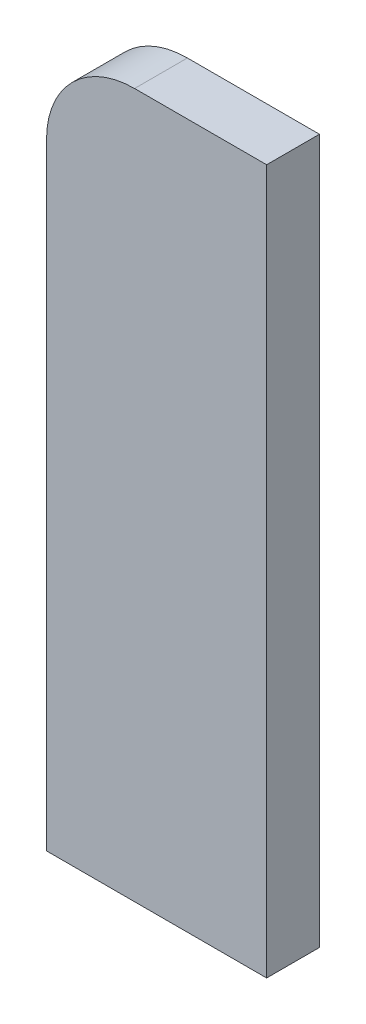
ISO-10303-21;
HEADER;
FILE_DESCRIPTION(('STEP AP214'),'2;1');
FILE_NAME('part.step','',(''),(''),'','','');
FILE_SCHEMA(('AUTOMOTIVE_DESIGN { 1 0 10303 214 1 1 1 1 }'));
ENDSEC;
DATA;
#1=APPLICATION_CONTEXT('core data for automotive mechanical design processes');
#2=APPLICATION_PROTOCOL_DEFINITION('international standard','automotive_design',2000,#1);
#3=PRODUCT_CONTEXT('',#1,'mechanical');
#4=PRODUCT('Part','Part','',(#3));
#5=PRODUCT_RELATED_PRODUCT_CATEGORY('part','',(#4));
#6=PRODUCT_DEFINITION_FORMATION('','',#4);
#7=PRODUCT_DEFINITION_CONTEXT('part definition',#1,'design');
#8=PRODUCT_DEFINITION('design','',#6,#7);
#9=PRODUCT_DEFINITION_SHAPE('','',#8);
#10=(LENGTH_UNIT() NAMED_UNIT(*) SI_UNIT(.MILLI.,.METRE.));
#11=(NAMED_UNIT(*) PLANE_ANGLE_UNIT() SI_UNIT($,.RADIAN.));
#12=(NAMED_UNIT(*) SI_UNIT($,.STERADIAN.) SOLID_ANGLE_UNIT());
#13=UNCERTAINTY_MEASURE_WITH_UNIT(LENGTH_MEASURE(1.E-05),#10,'distance_accuracy_value','');
#14=(GEOMETRIC_REPRESENTATION_CONTEXT(3) GLOBAL_UNCERTAINTY_ASSIGNED_CONTEXT((#13)) GLOBAL_UNIT_ASSIGNED_CONTEXT((#10,
#11,#12)) REPRESENTATION_CONTEXT('',''));
#15=CARTESIAN_POINT('',(0.,0.,0.));
#16=DIRECTION('',(0.,0.,1.));
#17=DIRECTION('',(1.,0.,0.));
#18=AXIS2_PLACEMENT_3D('',#15,#16,#17);
#19=CARTESIAN_POINT('',(-30.,50.,6.));
#20=DIRECTION('',(1.,0.,0.));
#21=DIRECTION('',(0.,0.,-1.));
#22=AXIS2_PLACEMENT_3D('',#19,#20,#21);
#23=PLANE('',#22);
#24=DIRECTION('',(0.,-1.,0.));
#25=VECTOR('',#24,1.);
#26=CARTESIAN_POINT('',(-30.,50.,6.));
#27=LINE('',#26,#25);
#28=CARTESIAN_POINT('',(-30.,40.,6.));
#29=VERTEX_POINT('',#28);
#30=CARTESIAN_POINT('',(-30.,-30.,6.));
#31=VERTEX_POINT('',#30);
#32=EDGE_CURVE('E110',#29,#31,#27,.T.);
#33=ORIENTED_EDGE('',*,*,#32,.F.);
#34=DIRECTION('',(0.,0.,-1.));
#35=VECTOR('',#34,1.);
#36=CARTESIAN_POINT('',(-30.,40.,6.));
#37=LINE('',#36,#35);
#38=CARTESIAN_POINT('',(-30.,40.,0.));
#39=VERTEX_POINT('',#38);
#40=EDGE_CURVE('E83',#29,#39,#37,.T.);
#41=ORIENTED_EDGE('',*,*,#40,.T.);
#42=DIRECTION('',(0.,-1.,0.));
#43=VECTOR('',#42,1.);
#44=CARTESIAN_POINT('',(-30.,50.,0.));
#45=LINE('',#44,#43);
#46=CARTESIAN_POINT('',(-30.,-30.,0.));
#47=VERTEX_POINT('',#46);
#48=EDGE_CURVE('E77',#39,#47,#45,.T.);
#49=ORIENTED_EDGE('',*,*,#48,.T.);
#50=DIRECTION('',(0.,0.,-1.));
#51=VECTOR('',#50,1.);
#52=CARTESIAN_POINT('',(-30.,-30.,6.));
#53=LINE('',#52,#51);
#54=EDGE_CURVE('E81',#31,#47,#53,.T.);
#55=ORIENTED_EDGE('',*,*,#54,.F.);
#56=EDGE_LOOP('',(#33,#41,#49,#55));
#57=FACE_BOUND('',#56,.T.);
#58=ADVANCED_FACE('F31',(#57),#23,.F.);
#59=CARTESIAN_POINT('',(-30.,-30.,6.));
#60=DIRECTION('',(0.,1.,0.));
#61=DIRECTION('',(0.,0.,1.));
#62=AXIS2_PLACEMENT_3D('',#59,#60,#61);
#63=PLANE('',#62);
#64=DIRECTION('',(1.,0.,0.));
#65=VECTOR('',#64,1.);
#66=CARTESIAN_POINT('',(-30.,-30.,0.));
#67=LINE('',#66,#65);
#68=CARTESIAN_POINT('',(-4.99999999999998,-30.,0.));
#69=VERTEX_POINT('',#68);
#70=EDGE_CURVE('E84',#47,#69,#67,.T.);
#71=ORIENTED_EDGE('',*,*,#70,.T.);
#72=DIRECTION('',(0.,0.,-1.));
#73=VECTOR('',#72,1.);
#74=CARTESIAN_POINT('',(-4.99999999999998,-30.,6.));
#75=LINE('',#74,#73);
#76=CARTESIAN_POINT('',(-4.99999999999998,-30.,6.));
#77=VERTEX_POINT('',#76);
#78=EDGE_CURVE('E96',#77,#69,#75,.T.);
#79=ORIENTED_EDGE('',*,*,#78,.F.);
#80=DIRECTION('',(1.,0.,0.));
#81=VECTOR('',#80,1.);
#82=CARTESIAN_POINT('',(-30.,-30.,6.));
#83=LINE('',#82,#81);
#84=EDGE_CURVE('E95',#31,#77,#83,.T.);
#85=ORIENTED_EDGE('',*,*,#84,.F.);
#86=ORIENTED_EDGE('',*,*,#54,.T.);
#87=EDGE_LOOP('',(#71,#79,#85,#86));
#88=FACE_BOUND('',#87,.T.);
#89=ADVANCED_FACE('F94',(#88),#63,.F.);
#90=CARTESIAN_POINT('',(-5.,50.,6.));
#91=DIRECTION('',(-1.,0.,0.));
#92=DIRECTION('',(0.,-1.,0.));
#93=AXIS2_PLACEMENT_3D('',#90,#91,#92);
#94=PLANE('',#93);
#95=DIRECTION('',(0.,1.,0.));
#96=VECTOR('',#95,1.);
#97=CARTESIAN_POINT('',(-5.,50.,0.));
#98=LINE('',#97,#96);
#99=CARTESIAN_POINT('',(-5.,50.,0.));
#100=VERTEX_POINT('',#99);
#101=EDGE_CURVE('E88',#69,#100,#98,.T.);
#102=ORIENTED_EDGE('',*,*,#101,.T.);
#103=DIRECTION('',(0.,0.,-1.));
#104=VECTOR('',#103,1.);
#105=CARTESIAN_POINT('',(-5.,50.,6.));
#106=LINE('',#105,#104);
#107=CARTESIAN_POINT('',(-5.,50.,6.));
#108=VERTEX_POINT('',#107);
#109=EDGE_CURVE('E99',#108,#100,#106,.T.);
#110=ORIENTED_EDGE('',*,*,#109,.F.);
#111=DIRECTION('',(0.,1.,0.));
#112=VECTOR('',#111,1.);
#113=CARTESIAN_POINT('',(-5.,50.,6.));
#114=LINE('',#113,#112);
#115=EDGE_CURVE('E107',#77,#108,#114,.T.);
#116=ORIENTED_EDGE('',*,*,#115,.F.);
#117=ORIENTED_EDGE('',*,*,#78,.T.);
#118=EDGE_LOOP('',(#102,#110,#116,#117));
#119=FACE_BOUND('',#118,.T.);
#120=ADVANCED_FACE('F116',(#119),#94,.F.);
#121=CARTESIAN_POINT('',(-30.,50.,6.));
#122=DIRECTION('',(0.,-1.,0.));
#123=DIRECTION('',(0.,0.,-1.));
#124=AXIS2_PLACEMENT_3D('',#121,#122,#123);
#125=PLANE('',#124);
#126=DIRECTION('',(-1.,0.,0.));
#127=VECTOR('',#126,1.);
#128=CARTESIAN_POINT('',(-30.,50.,0.));
#129=LINE('',#128,#127);
#130=CARTESIAN_POINT('',(-20.,50.,0.));
#131=VERTEX_POINT('',#130);
#132=EDGE_CURVE('E112',#100,#131,#129,.T.);
#133=ORIENTED_EDGE('',*,*,#132,.T.);
#134=DIRECTION('',(0.,0.,-1.));
#135=VECTOR('',#134,1.);
#136=CARTESIAN_POINT('',(-20.,50.,6.));
#137=LINE('',#136,#135);
#138=CARTESIAN_POINT('',(-20.,50.,6.));
#139=VERTEX_POINT('',#138);
#140=EDGE_CURVE('E38',#131,#139,#137,.F.);
#141=ORIENTED_EDGE('',*,*,#140,.T.);
#142=DIRECTION('',(-1.,0.,0.));
#143=VECTOR('',#142,1.);
#144=CARTESIAN_POINT('',(-30.,50.,6.));
#145=LINE('',#144,#143);
#146=EDGE_CURVE('E105',#108,#139,#145,.T.);
#147=ORIENTED_EDGE('',*,*,#146,.F.);
#148=ORIENTED_EDGE('',*,*,#109,.T.);
#149=EDGE_LOOP('',(#133,#141,#147,#148));
#150=FACE_BOUND('',#149,.T.);
#151=ADVANCED_FACE('F118',(#150),#125,.F.);
#152=CARTESIAN_POINT('',(-30.,-30.,6.));
#153=DIRECTION('',(0.,0.,1.));
#154=DIRECTION('',(1.,0.,0.));
#155=AXIS2_PLACEMENT_3D('',#152,#153,#154);
#156=PLANE('',#155);
#157=ORIENTED_EDGE('',*,*,#146,.T.);
#158=CARTESIAN_POINT('',(-20.,40.,6.));
#159=DIRECTION('',(0.,0.,1.));
#160=DIRECTION('',(1.,0.,0.));
#161=AXIS2_PLACEMENT_3D('',#158,#159,#160);
#162=CIRCLE('',#161,10.);
#163=EDGE_CURVE('E11',#139,#29,#162,.T.);
#164=ORIENTED_EDGE('',*,*,#163,.T.);
#165=ORIENTED_EDGE('',*,*,#32,.T.);
#166=ORIENTED_EDGE('',*,*,#84,.T.);
#167=ORIENTED_EDGE('',*,*,#115,.T.);
#168=EDGE_LOOP('',(#157,#164,#165,#166,#167));
#169=FACE_BOUND('',#168,.T.);
#170=ADVANCED_FACE('F121',(#169),#156,.T.);
#171=CARTESIAN_POINT('',(-30.,-30.,0.));
#172=DIRECTION('',(0.,0.,1.));
#173=DIRECTION('',(1.,0.,0.));
#174=AXIS2_PLACEMENT_3D('',#171,#172,#173);
#175=PLANE('',#174);
#176=ORIENTED_EDGE('',*,*,#48,.F.);
#177=CARTESIAN_POINT('',(-20.,40.,0.));
#178=DIRECTION('',(0.,0.,1.));
#179=DIRECTION('',(1.,0.,0.));
#180=AXIS2_PLACEMENT_3D('',#177,#178,#179);
#181=CIRCLE('',#180,10.);
#182=EDGE_CURVE('E52',#39,#131,#181,.F.);
#183=ORIENTED_EDGE('',*,*,#182,.T.);
#184=ORIENTED_EDGE('',*,*,#132,.F.);
#185=ORIENTED_EDGE('',*,*,#101,.F.);
#186=ORIENTED_EDGE('',*,*,#70,.F.);
#187=EDGE_LOOP('',(#176,#183,#184,#185,#186));
#188=FACE_BOUND('',#187,.T.);
#189=ADVANCED_FACE('F87',(#188),#175,.F.);
#190=CARTESIAN_POINT('',(-20.,40.,6.));
#191=DIRECTION('',(0.,0.,-1.));
#192=DIRECTION('',(-1.,0.,0.));
#193=AXIS2_PLACEMENT_3D('',#190,#191,#192);
#194=CYLINDRICAL_SURFACE('',#193,10.);
#195=ORIENTED_EDGE('',*,*,#163,.F.);
#196=ORIENTED_EDGE('',*,*,#140,.F.);
#197=ORIENTED_EDGE('',*,*,#182,.F.);
#198=ORIENTED_EDGE('',*,*,#40,.F.);
#199=EDGE_LOOP('',(#195,#196,#197,#198));
#200=FACE_BOUND('',#199,.T.);
#201=ADVANCED_FACE('F123',(#200),#194,.T.);
#202=CLOSED_SHELL('',(#58,#89,#120,#151,#170,#189,#201));
#203=MANIFOLD_SOLID_BREP('B2',#202);
#204=ADVANCED_BREP_SHAPE_REPRESENTATION('',(#18,#203),#14);
#205=SHAPE_DEFINITION_REPRESENTATION(#9,#204);
ENDSEC;
END-ISO-10303-21;
